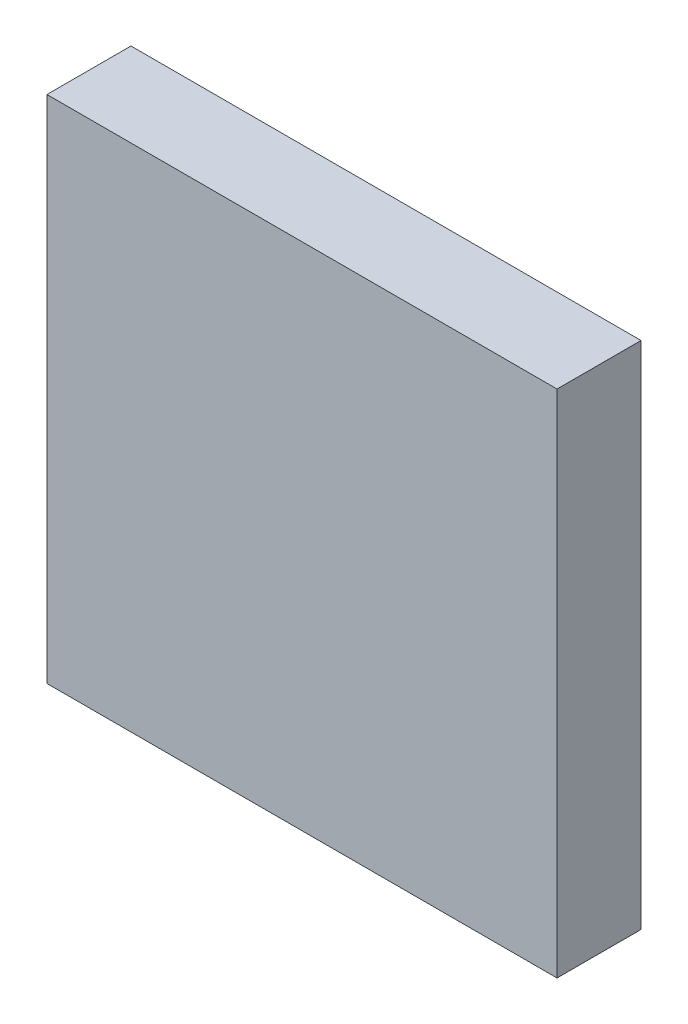
ISO-10303-21;
HEADER;
FILE_DESCRIPTION(('STEP AP214'),'2;1');
FILE_NAME('part.step','',(''),(''),'','','');
FILE_SCHEMA(('AUTOMOTIVE_DESIGN { 1 0 10303 214 1 1 1 1 }'));
ENDSEC;
DATA;
#1=APPLICATION_CONTEXT('core data for automotive mechanical design processes');
#2=APPLICATION_PROTOCOL_DEFINITION('international standard','automotive_design',2000,#1);
#3=PRODUCT_CONTEXT('',#1,'mechanical');
#4=PRODUCT('Part','Part','',(#3));
#5=PRODUCT_RELATED_PRODUCT_CATEGORY('part','',(#4));
#6=PRODUCT_DEFINITION_FORMATION('','',#4);
#7=PRODUCT_DEFINITION_CONTEXT('part definition',#1,'design');
#8=PRODUCT_DEFINITION('design','',#6,#7);
#9=PRODUCT_DEFINITION_SHAPE('','',#8);
#10=(LENGTH_UNIT() NAMED_UNIT(*) SI_UNIT(.MILLI.,.METRE.));
#11=(NAMED_UNIT(*) PLANE_ANGLE_UNIT() SI_UNIT($,.RADIAN.));
#12=(NAMED_UNIT(*) SI_UNIT($,.STERADIAN.) SOLID_ANGLE_UNIT());
#13=UNCERTAINTY_MEASURE_WITH_UNIT(LENGTH_MEASURE(1.E-05),#10,'distance_accuracy_value','');
#14=(GEOMETRIC_REPRESENTATION_CONTEXT(3) GLOBAL_UNCERTAINTY_ASSIGNED_CONTEXT((#13)) GLOBAL_UNIT_ASSIGNED_CONTEXT((#10,
#11,#12)) REPRESENTATION_CONTEXT('',''));
#15=CARTESIAN_POINT('',(0.,0.,0.));
#16=DIRECTION('',(0.,0.,1.));
#17=DIRECTION('',(1.,0.,0.));
#18=AXIS2_PLACEMENT_3D('',#15,#16,#17);
#19=CARTESIAN_POINT('',(2.54999998,-2.54999998,0.));
#20=DIRECTION('',(0.,-1.,0.));
#21=DIRECTION('',(-1.,0.,0.));
#22=AXIS2_PLACEMENT_3D('',#19,#20,#21);
#23=PLANE('',#22);
#24=DIRECTION('',(0.,0.,1.));
#25=VECTOR('',#24,1.);
#26=CARTESIAN_POINT('',(2.54999998,-2.54999998,0.));
#27=LINE('',#26,#25);
#28=CARTESIAN_POINT('',(2.54999998,-2.54999998,0.));
#29=VERTEX_POINT('',#28);
#30=CARTESIAN_POINT('',(2.54999998,-2.54999998,0.84000086));
#31=VERTEX_POINT('',#30);
#32=EDGE_CURVE('E10',#29,#31,#27,.T.);
#33=ORIENTED_EDGE('',*,*,#32,.T.);
#34=DIRECTION('',(-1.,0.,0.));
#35=VECTOR('',#34,1.);
#36=CARTESIAN_POINT('',(2.54999998,-2.54999998,0.84000086));
#37=LINE('',#36,#35);
#38=CARTESIAN_POINT('',(-2.54999998,-2.54999998,0.84000086));
#39=VERTEX_POINT('',#38);
#40=EDGE_CURVE('E23',#31,#39,#37,.T.);
#41=ORIENTED_EDGE('',*,*,#40,.T.);
#42=DIRECTION('',(0.,0.,1.));
#43=VECTOR('',#42,1.);
#44=CARTESIAN_POINT('',(-2.54999998,-2.54999998,0.));
#45=LINE('',#44,#43);
#46=CARTESIAN_POINT('',(-2.54999998,-2.54999998,0.));
#47=VERTEX_POINT('',#46);
#48=EDGE_CURVE('E84',#47,#39,#45,.T.);
#49=ORIENTED_EDGE('',*,*,#48,.F.);
#50=DIRECTION('',(-1.,0.,0.));
#51=VECTOR('',#50,1.);
#52=CARTESIAN_POINT('',(2.54999998,-2.54999998,0.));
#53=LINE('',#52,#51);
#54=EDGE_CURVE('E82',#29,#47,#53,.T.);
#55=ORIENTED_EDGE('',*,*,#54,.F.);
#56=EDGE_LOOP('',(#33,#41,#49,#55));
#57=FACE_BOUND('',#56,.T.);
#58=ADVANCED_FACE('F16',(#57),#23,.T.);
#59=CARTESIAN_POINT('',(-2.54999998,-2.54999998,0.));
#60=DIRECTION('',(-1.,0.,0.));
#61=DIRECTION('',(0.,1.,0.));
#62=AXIS2_PLACEMENT_3D('',#59,#60,#61);
#63=PLANE('',#62);
#64=ORIENTED_EDGE('',*,*,#48,.T.);
#65=DIRECTION('',(0.,1.,0.));
#66=VECTOR('',#65,1.);
#67=CARTESIAN_POINT('',(-2.54999998,-2.54999998,0.84000086));
#68=LINE('',#67,#66);
#69=CARTESIAN_POINT('',(-2.54999998,2.54999998,0.84000086));
#70=VERTEX_POINT('',#69);
#71=EDGE_CURVE('E80',#39,#70,#68,.T.);
#72=ORIENTED_EDGE('',*,*,#71,.T.);
#73=DIRECTION('',(0.,0.,1.));
#74=VECTOR('',#73,1.);
#75=CARTESIAN_POINT('',(-2.54999998,2.54999998,0.));
#76=LINE('',#75,#74);
#77=CARTESIAN_POINT('',(-2.54999998,2.54999998,0.));
#78=VERTEX_POINT('',#77);
#79=EDGE_CURVE('E78',#78,#70,#76,.T.);
#80=ORIENTED_EDGE('',*,*,#79,.F.);
#81=DIRECTION('',(0.,1.,0.));
#82=VECTOR('',#81,1.);
#83=CARTESIAN_POINT('',(-2.54999998,-2.54999998,0.));
#84=LINE('',#83,#82);
#85=EDGE_CURVE('E69',#47,#78,#84,.T.);
#86=ORIENTED_EDGE('',*,*,#85,.F.);
#87=EDGE_LOOP('',(#64,#72,#80,#86));
#88=FACE_BOUND('',#87,.T.);
#89=ADVANCED_FACE('F89',(#88),#63,.T.);
#90=CARTESIAN_POINT('',(-2.54999998,2.54999998,0.));
#91=DIRECTION('',(0.,1.,0.));
#92=DIRECTION('',(1.,0.,0.));
#93=AXIS2_PLACEMENT_3D('',#90,#91,#92);
#94=PLANE('',#93);
#95=ORIENTED_EDGE('',*,*,#79,.T.);
#96=DIRECTION('',(1.,0.,0.));
#97=VECTOR('',#96,1.);
#98=CARTESIAN_POINT('',(-2.54999998,2.54999998,0.84000086));
#99=LINE('',#98,#97);
#100=CARTESIAN_POINT('',(2.54999998,2.54999998,0.84000086));
#101=VERTEX_POINT('',#100);
#102=EDGE_CURVE('E59',#70,#101,#99,.T.);
#103=ORIENTED_EDGE('',*,*,#102,.T.);
#104=DIRECTION('',(0.,0.,1.));
#105=VECTOR('',#104,1.);
#106=CARTESIAN_POINT('',(2.54999998,2.54999998,0.));
#107=LINE('',#106,#105);
#108=CARTESIAN_POINT('',(2.54999998,2.54999998,0.));
#109=VERTEX_POINT('',#108);
#110=EDGE_CURVE('E53',#109,#101,#107,.T.);
#111=ORIENTED_EDGE('',*,*,#110,.F.);
#112=DIRECTION('',(1.,0.,0.));
#113=VECTOR('',#112,1.);
#114=CARTESIAN_POINT('',(-2.54999998,2.54999998,0.));
#115=LINE('',#114,#113);
#116=EDGE_CURVE('E57',#78,#109,#115,.T.);
#117=ORIENTED_EDGE('',*,*,#116,.F.);
#118=EDGE_LOOP('',(#95,#103,#111,#117));
#119=FACE_BOUND('',#118,.T.);
#120=ADVANCED_FACE('F56',(#119),#94,.T.);
#121=CARTESIAN_POINT('',(2.54999998,2.54999998,0.));
#122=DIRECTION('',(1.,0.,0.));
#123=DIRECTION('',(0.,-1.,0.));
#124=AXIS2_PLACEMENT_3D('',#121,#122,#123);
#125=PLANE('',#124);
#126=ORIENTED_EDGE('',*,*,#110,.T.);
#127=DIRECTION('',(0.,-1.,0.));
#128=VECTOR('',#127,1.);
#129=CARTESIAN_POINT('',(2.54999998,2.54999998,0.84000086));
#130=LINE('',#129,#128);
#131=EDGE_CURVE('E70',#101,#31,#130,.T.);
#132=ORIENTED_EDGE('',*,*,#131,.T.);
#133=ORIENTED_EDGE('',*,*,#32,.F.);
#134=DIRECTION('',(0.,-1.,0.));
#135=VECTOR('',#134,1.);
#136=CARTESIAN_POINT('',(2.54999998,2.54999998,0.));
#137=LINE('',#136,#135);
#138=EDGE_CURVE('E67',#109,#29,#137,.T.);
#139=ORIENTED_EDGE('',*,*,#138,.F.);
#140=EDGE_LOOP('',(#126,#132,#133,#139));
#141=FACE_BOUND('',#140,.T.);
#142=ADVANCED_FACE('F72',(#141),#125,.T.);
#143=CARTESIAN_POINT('',(2.54999998,-2.54999998,0.));
#144=DIRECTION('',(0.,0.,1.));
#145=DIRECTION('',(1.,0.,0.));
#146=AXIS2_PLACEMENT_3D('',#143,#144,#145);
#147=PLANE('',#146);
#148=ORIENTED_EDGE('',*,*,#54,.T.);
#149=ORIENTED_EDGE('',*,*,#85,.T.);
#150=ORIENTED_EDGE('',*,*,#116,.T.);
#151=ORIENTED_EDGE('',*,*,#138,.T.);
#152=EDGE_LOOP('',(#148,#149,#150,#151));
#153=FACE_BOUND('',#152,.T.);
#154=ADVANCED_FACE('F66',(#153),#147,.F.);
#155=CARTESIAN_POINT('',(2.54999998,-2.54999998,0.84000086));
#156=DIRECTION('',(0.,0.,1.));
#157=DIRECTION('',(1.,0.,0.));
#158=AXIS2_PLACEMENT_3D('',#155,#156,#157);
#159=PLANE('',#158);
#160=ORIENTED_EDGE('',*,*,#131,.F.);
#161=ORIENTED_EDGE('',*,*,#102,.F.);
#162=ORIENTED_EDGE('',*,*,#71,.F.);
#163=ORIENTED_EDGE('',*,*,#40,.F.);
#164=EDGE_LOOP('',(#160,#161,#162,#163));
#165=FACE_BOUND('',#164,.T.);
#166=ADVANCED_FACE('F90',(#165),#159,.T.);
#167=CLOSED_SHELL('',(#58,#89,#120,#142,#154,#166));
#168=MANIFOLD_SOLID_BREP('B1',#167);
#169=ADVANCED_BREP_SHAPE_REPRESENTATION('',(#18,#168),#14);
#170=SHAPE_DEFINITION_REPRESENTATION(#9,#169);
ENDSEC;
END-ISO-10303-21;
